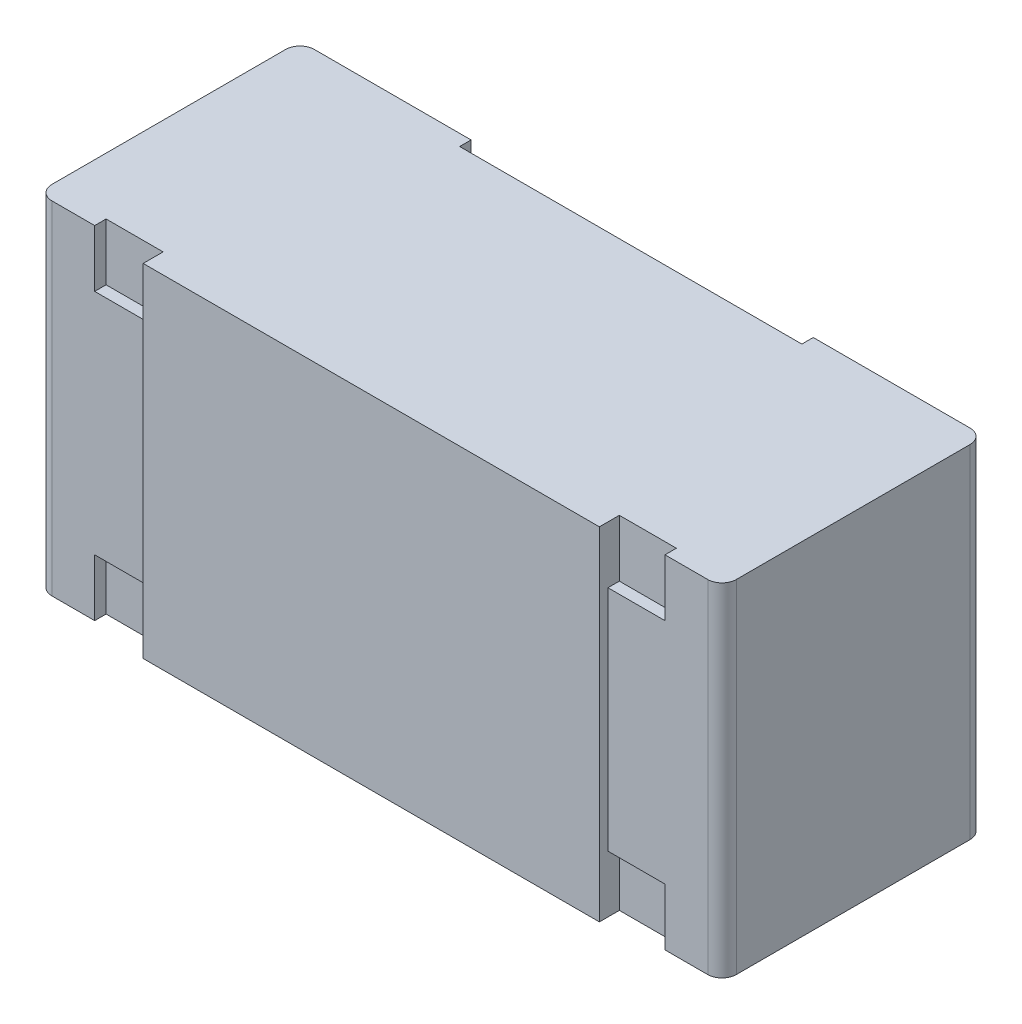
ISO-10303-21;
HEADER;
FILE_DESCRIPTION(('STEP AP214'),'2;1');
FILE_NAME('part.step','',(''),(''),'','','');
FILE_SCHEMA(('AUTOMOTIVE_DESIGN { 1 0 10303 214 1 1 1 1 }'));
ENDSEC;
DATA;
#1=APPLICATION_CONTEXT('core data for automotive mechanical design processes');
#2=APPLICATION_PROTOCOL_DEFINITION('international standard','automotive_design',2000,#1);
#3=PRODUCT_CONTEXT('',#1,'mechanical');
#4=PRODUCT('Part','Part','',(#3));
#5=PRODUCT_RELATED_PRODUCT_CATEGORY('part','',(#4));
#6=PRODUCT_DEFINITION_FORMATION('','',#4);
#7=PRODUCT_DEFINITION_CONTEXT('part definition',#1,'design');
#8=PRODUCT_DEFINITION('design','',#6,#7);
#9=PRODUCT_DEFINITION_SHAPE('','',#8);
#10=(LENGTH_UNIT() NAMED_UNIT(*) SI_UNIT(.MILLI.,.METRE.));
#11=(NAMED_UNIT(*) PLANE_ANGLE_UNIT() SI_UNIT($,.RADIAN.));
#12=(NAMED_UNIT(*) SI_UNIT($,.STERADIAN.) SOLID_ANGLE_UNIT());
#13=UNCERTAINTY_MEASURE_WITH_UNIT(LENGTH_MEASURE(1.E-05),#10,'distance_accuracy_value','');
#14=(GEOMETRIC_REPRESENTATION_CONTEXT(3) GLOBAL_UNCERTAINTY_ASSIGNED_CONTEXT((#13)) GLOBAL_UNIT_ASSIGNED_CONTEXT((#10,
#11,#12)) REPRESENTATION_CONTEXT('',''));
#15=CARTESIAN_POINT('',(0.,0.,0.));
#16=DIRECTION('',(0.,0.,1.));
#17=DIRECTION('',(1.,0.,0.));
#18=AXIS2_PLACEMENT_3D('',#15,#16,#17);
#19=CARTESIAN_POINT('',(-0.2,-0.1,0.149289321881));
#20=DIRECTION('',(0.,1.,0.));
#21=DIRECTION('',(0.,0.,1.));
#22=AXIS2_PLACEMENT_3D('',#19,#20,#21);
#23=PLANE('',#22);
#24=DIRECTION('',(-1.,0.,0.));
#25=VECTOR('',#24,1.);
#26=CARTESIAN_POINT('',(0.3,-0.1,0.23));
#27=LINE('',#26,#25);
#28=CARTESIAN_POINT('',(-0.2,-0.1,0.23));
#29=VERTEX_POINT('',#28);
#30=CARTESIAN_POINT('',(-0.25,-0.1,0.23));
#31=VERTEX_POINT('',#30);
#32=EDGE_CURVE('E406',#29,#31,#27,.T.);
#33=ORIENTED_EDGE('',*,*,#32,.T.);
#34=DIRECTION('',(0.,0.,1.));
#35=VECTOR('',#34,1.);
#36=CARTESIAN_POINT('',(-0.25,-0.1,0.149289321881));
#37=LINE('',#36,#35);
#38=CARTESIAN_POINT('',(-0.25,-0.1,0.22));
#39=VERTEX_POINT('',#38);
#40=EDGE_CURVE('E409',#31,#39,#37,.F.);
#41=ORIENTED_EDGE('',*,*,#40,.T.);
#42=DIRECTION('',(-1.,0.,0.));
#43=VECTOR('',#42,1.);
#44=CARTESIAN_POINT('',(0.2875,-0.1,0.22));
#45=LINE('',#44,#43);
#46=CARTESIAN_POINT('',(-0.2,-0.1,0.22));
#47=VERTEX_POINT('',#46);
#48=EDGE_CURVE('E402',#39,#47,#45,.F.);
#49=ORIENTED_EDGE('',*,*,#48,.T.);
#50=DIRECTION('',(0.,0.,-1.));
#51=VECTOR('',#50,1.);
#52=CARTESIAN_POINT('',(-0.2,-0.1,0.2375));
#53=LINE('',#52,#51);
#54=EDGE_CURVE('E264',#47,#29,#53,.F.);
#55=ORIENTED_EDGE('',*,*,#54,.T.);
#56=EDGE_LOOP('',(#33,#41,#49,#55));
#57=FACE_BOUND('',#56,.T.);
#58=ADVANCED_FACE('F17',(#57),#23,.F.);
#59=CARTESIAN_POINT('',(-0.25,-0.15,0.149289321881));
#60=DIRECTION('',(-1.,0.,0.));
#61=DIRECTION('',(0.,0.,1.));
#62=AXIS2_PLACEMENT_3D('',#59,#60,#61);
#63=PLANE('',#62);
#64=DIRECTION('',(0.,1.,0.));
#65=VECTOR('',#64,1.);
#66=CARTESIAN_POINT('',(-0.25,0.,0.23));
#67=LINE('',#66,#65);
#68=CARTESIAN_POINT('',(-0.25,-0.15,0.23));
#69=VERTEX_POINT('',#68);
#70=EDGE_CURVE('E220',#31,#69,#67,.F.);
#71=ORIENTED_EDGE('',*,*,#70,.T.);
#72=DIRECTION('',(0.,0.,-1.));
#73=VECTOR('',#72,1.);
#74=CARTESIAN_POINT('',(-0.25,-0.15,0.0125));
#75=LINE('',#74,#73);
#76=CARTESIAN_POINT('',(-0.25,-0.15,0.22));
#77=VERTEX_POINT('',#76);
#78=EDGE_CURVE('E215',#77,#69,#75,.F.);
#79=ORIENTED_EDGE('',*,*,#78,.F.);
#80=DIRECTION('',(0.,1.,0.));
#81=VECTOR('',#80,1.);
#82=CARTESIAN_POINT('',(-0.25,0.766846820532,0.22));
#83=LINE('',#82,#81);
#84=EDGE_CURVE('E411',#77,#39,#83,.T.);
#85=ORIENTED_EDGE('',*,*,#84,.T.);
#86=ORIENTED_EDGE('',*,*,#40,.F.);
#87=EDGE_LOOP('',(#71,#79,#85,#86));
#88=FACE_BOUND('',#87,.T.);
#89=ADVANCED_FACE('F649',(#88),#63,.F.);
#90=CARTESIAN_POINT('',(0.2875,0.766846820532,0.22));
#91=DIRECTION('',(0.,0.,-1.));
#92=DIRECTION('',(-1.,0.,0.));
#93=AXIS2_PLACEMENT_3D('',#90,#91,#92);
#94=PLANE('',#93);
#95=DIRECTION('',(1.,0.,0.));
#96=VECTOR('',#95,1.);
#97=CARTESIAN_POINT('',(0.2,-0.1,0.22));
#98=LINE('',#97,#96);
#99=CARTESIAN_POINT('',(0.25,-0.1,0.22));
#100=VERTEX_POINT('',#99);
#101=CARTESIAN_POINT('',(0.2,-0.1,0.22));
#102=VERTEX_POINT('',#101);
#103=EDGE_CURVE('E466',#100,#102,#98,.F.);
#104=ORIENTED_EDGE('',*,*,#103,.T.);
#105=DIRECTION('',(0.,1.,0.));
#106=VECTOR('',#105,1.);
#107=CARTESIAN_POINT('',(0.2,-0.15,0.22));
#108=LINE('',#107,#106);
#109=CARTESIAN_POINT('',(0.2,-0.15,0.22));
#110=VERTEX_POINT('',#109);
#111=EDGE_CURVE('E364',#102,#110,#108,.F.);
#112=ORIENTED_EDGE('',*,*,#111,.T.);
#113=DIRECTION('',(1.,0.,0.));
#114=VECTOR('',#113,1.);
#115=CARTESIAN_POINT('',(0.2875,-0.15,0.22));
#116=LINE('',#115,#114);
#117=CARTESIAN_POINT('',(0.25,-0.15,0.22));
#118=VERTEX_POINT('',#117);
#119=EDGE_CURVE('E434',#118,#110,#116,.F.);
#120=ORIENTED_EDGE('',*,*,#119,.F.);
#121=DIRECTION('',(0.,1.,0.));
#122=VECTOR('',#121,1.);
#123=CARTESIAN_POINT('',(0.25,-0.15,0.22));
#124=LINE('',#123,#122);
#125=EDGE_CURVE('E401',#118,#100,#124,.T.);
#126=ORIENTED_EDGE('',*,*,#125,.T.);
#127=EDGE_LOOP('',(#104,#112,#120,#126));
#128=FACE_BOUND('',#127,.T.);
#129=ADVANCED_FACE('F642',(#128),#94,.F.);
#130=CARTESIAN_POINT('',(0.2875,0.766846820532,0.22));
#131=DIRECTION('',(0.,0.,-1.));
#132=DIRECTION('',(-1.,0.,0.));
#133=AXIS2_PLACEMENT_3D('',#130,#131,#132);
#134=PLANE('',#133);
#135=ORIENTED_EDGE('',*,*,#84,.F.);
#136=DIRECTION('',(1.,0.,0.));
#137=VECTOR('',#136,1.);
#138=CARTESIAN_POINT('',(0.2875,-0.15,0.22));
#139=LINE('',#138,#137);
#140=CARTESIAN_POINT('',(-0.2,-0.15,0.22));
#141=VERTEX_POINT('',#140);
#142=EDGE_CURVE('E304',#141,#77,#139,.F.);
#143=ORIENTED_EDGE('',*,*,#142,.F.);
#144=DIRECTION('',(0.,1.,0.));
#145=VECTOR('',#144,1.);
#146=CARTESIAN_POINT('',(-0.2,0.15,0.22));
#147=LINE('',#146,#145);
#148=EDGE_CURVE('E423',#141,#47,#147,.T.);
#149=ORIENTED_EDGE('',*,*,#148,.T.);
#150=ORIENTED_EDGE('',*,*,#48,.F.);
#151=EDGE_LOOP('',(#135,#143,#149,#150));
#152=FACE_BOUND('',#151,.T.);
#153=ADVANCED_FACE('F648',(#152),#134,.F.);
#154=CARTESIAN_POINT('',(0.25,-0.15,0.149289321881));
#155=DIRECTION('',(1.,0.,0.));
#156=DIRECTION('',(0.,1.,0.));
#157=AXIS2_PLACEMENT_3D('',#154,#155,#156);
#158=PLANE('',#157);
#159=DIRECTION('',(0.,1.,0.));
#160=VECTOR('',#159,1.);
#161=CARTESIAN_POINT('',(0.25,0.,0.23));
#162=LINE('',#161,#160);
#163=CARTESIAN_POINT('',(0.25,-0.15,0.23));
#164=VERTEX_POINT('',#163);
#165=CARTESIAN_POINT('',(0.25,-0.1,0.23));
#166=VERTEX_POINT('',#165);
#167=EDGE_CURVE('E338',#164,#166,#162,.T.);
#168=ORIENTED_EDGE('',*,*,#167,.T.);
#169=DIRECTION('',(0.,0.,1.));
#170=VECTOR('',#169,1.);
#171=CARTESIAN_POINT('',(0.25,-0.1,0.149289321881));
#172=LINE('',#171,#170);
#173=EDGE_CURVE('E345',#166,#100,#172,.F.);
#174=ORIENTED_EDGE('',*,*,#173,.T.);
#175=ORIENTED_EDGE('',*,*,#125,.F.);
#176=DIRECTION('',(0.,0.,-1.));
#177=VECTOR('',#176,1.);
#178=CARTESIAN_POINT('',(0.25,-0.15,0.0125));
#179=LINE('',#178,#177);
#180=EDGE_CURVE('E341',#164,#118,#179,.T.);
#181=ORIENTED_EDGE('',*,*,#180,.F.);
#182=EDGE_LOOP('',(#168,#174,#175,#181));
#183=FACE_BOUND('',#182,.T.);
#184=ADVANCED_FACE('F661',(#183),#158,.F.);
#185=CARTESIAN_POINT('',(0.2,-0.1,0.149289321881));
#186=DIRECTION('',(0.,1.,0.));
#187=DIRECTION('',(0.,0.,1.));
#188=AXIS2_PLACEMENT_3D('',#185,#186,#187);
#189=PLANE('',#188);
#190=DIRECTION('',(-1.,0.,0.));
#191=VECTOR('',#190,1.);
#192=CARTESIAN_POINT('',(0.3,-0.1,0.23));
#193=LINE('',#192,#191);
#194=CARTESIAN_POINT('',(0.2,-0.1,0.23));
#195=VERTEX_POINT('',#194);
#196=EDGE_CURVE('E350',#166,#195,#193,.T.);
#197=ORIENTED_EDGE('',*,*,#196,.T.);
#198=DIRECTION('',(0.,0.,1.));
#199=VECTOR('',#198,1.);
#200=CARTESIAN_POINT('',(0.2,-0.1,0.2375));
#201=LINE('',#200,#199);
#202=EDGE_CURVE('E361',#195,#102,#201,.F.);
#203=ORIENTED_EDGE('',*,*,#202,.T.);
#204=ORIENTED_EDGE('',*,*,#103,.F.);
#205=ORIENTED_EDGE('',*,*,#173,.F.);
#206=EDGE_LOOP('',(#197,#203,#204,#205));
#207=FACE_BOUND('',#206,.T.);
#208=ADVANCED_FACE('F831',(#207),#189,.F.);
#209=CARTESIAN_POINT('',(0.2,0.1,0.149289321881));
#210=DIRECTION('',(0.,-1.,0.));
#211=DIRECTION('',(0.,0.,-1.));
#212=AXIS2_PLACEMENT_3D('',#209,#210,#211);
#213=PLANE('',#212);
#214=DIRECTION('',(-1.,0.,0.));
#215=VECTOR('',#214,1.);
#216=CARTESIAN_POINT('',(0.3,0.1,0.23));
#217=LINE('',#216,#215);
#218=CARTESIAN_POINT('',(0.2,0.1,0.23));
#219=VERTEX_POINT('',#218);
#220=CARTESIAN_POINT('',(0.25,0.1,0.23));
#221=VERTEX_POINT('',#220);
#222=EDGE_CURVE('E325',#219,#221,#217,.F.);
#223=ORIENTED_EDGE('',*,*,#222,.T.);
#224=DIRECTION('',(0.,0.,-1.));
#225=VECTOR('',#224,1.);
#226=CARTESIAN_POINT('',(0.25,0.1,0.149289321881));
#227=LINE('',#226,#225);
#228=CARTESIAN_POINT('',(0.25,0.1,0.22));
#229=VERTEX_POINT('',#228);
#230=EDGE_CURVE('E311',#221,#229,#227,.T.);
#231=ORIENTED_EDGE('',*,*,#230,.T.);
#232=DIRECTION('',(-1.,0.,0.));
#233=VECTOR('',#232,1.);
#234=CARTESIAN_POINT('',(0.2875,0.1,0.22));
#235=LINE('',#234,#233);
#236=CARTESIAN_POINT('',(0.2,0.1,0.22));
#237=VERTEX_POINT('',#236);
#238=EDGE_CURVE('E287',#229,#237,#235,.T.);
#239=ORIENTED_EDGE('',*,*,#238,.T.);
#240=DIRECTION('',(0.,0.,1.));
#241=VECTOR('',#240,1.);
#242=CARTESIAN_POINT('',(0.2,0.1,0.2375));
#243=LINE('',#242,#241);
#244=EDGE_CURVE('E282',#237,#219,#243,.T.);
#245=ORIENTED_EDGE('',*,*,#244,.T.);
#246=EDGE_LOOP('',(#223,#231,#239,#245));
#247=FACE_BOUND('',#246,.T.);
#248=ADVANCED_FACE('F572',(#247),#213,.F.);
#249=CARTESIAN_POINT('',(0.,0.,0.2375));
#250=DIRECTION('',(0.,0.,1.));
#251=DIRECTION('',(1.,0.,0.));
#252=AXIS2_PLACEMENT_3D('',#249,#250,#251);
#253=PLANE('',#252);
#254=DIRECTION('',(0.,1.,0.));
#255=VECTOR('',#254,1.);
#256=CARTESIAN_POINT('',(0.2,-0.15,0.2375));
#257=LINE('',#256,#255);
#258=CARTESIAN_POINT('',(0.2,-0.15,0.2375));
#259=VERTEX_POINT('',#258);
#260=CARTESIAN_POINT('',(0.2,0.15,0.2375));
#261=VERTEX_POINT('',#260);
#262=EDGE_CURVE('E290',#259,#261,#257,.T.);
#263=ORIENTED_EDGE('',*,*,#262,.T.);
#264=DIRECTION('',(1.,0.,0.));
#265=VECTOR('',#264,1.);
#266=CARTESIAN_POINT('',(0.15,0.15,0.2375));
#267=LINE('',#266,#265);
#268=CARTESIAN_POINT('',(-0.2,0.15,0.2375));
#269=VERTEX_POINT('',#268);
#270=EDGE_CURVE('E275',#261,#269,#267,.F.);
#271=ORIENTED_EDGE('',*,*,#270,.T.);
#272=DIRECTION('',(0.,1.,0.));
#273=VECTOR('',#272,1.);
#274=CARTESIAN_POINT('',(-0.2,0.15,0.2375));
#275=LINE('',#274,#273);
#276=CARTESIAN_POINT('',(-0.2,-0.15,0.2375));
#277=VERTEX_POINT('',#276);
#278=EDGE_CURVE('E278',#269,#277,#275,.F.);
#279=ORIENTED_EDGE('',*,*,#278,.T.);
#280=DIRECTION('',(1.,0.,0.));
#281=VECTOR('',#280,1.);
#282=CARTESIAN_POINT('',(0.,-0.15,0.2375));
#283=LINE('',#282,#281);
#284=EDGE_CURVE('E344',#277,#259,#283,.T.);
#285=ORIENTED_EDGE('',*,*,#284,.T.);
#286=EDGE_LOOP('',(#263,#271,#279,#285));
#287=FACE_BOUND('',#286,.T.);
#288=ADVANCED_FACE('F813',(#287),#253,.T.);
#289=CARTESIAN_POINT('',(0.2,-0.15,0.2375));
#290=DIRECTION('',(-1.,0.,0.));
#291=DIRECTION('',(0.,0.,1.));
#292=AXIS2_PLACEMENT_3D('',#289,#290,#291);
#293=PLANE('',#292);
#294=DIRECTION('',(0.,1.,0.));
#295=VECTOR('',#294,1.);
#296=CARTESIAN_POINT('',(0.2,0.766846820532,0.22));
#297=LINE('',#296,#295);
#298=CARTESIAN_POINT('',(0.2,0.15,0.22));
#299=VERTEX_POINT('',#298);
#300=EDGE_CURVE('E444',#237,#299,#297,.T.);
#301=ORIENTED_EDGE('',*,*,#300,.T.);
#302=DIRECTION('',(0.,0.,-1.));
#303=VECTOR('',#302,1.);
#304=CARTESIAN_POINT('',(0.2,0.15,0.));
#305=LINE('',#304,#303);
#306=EDGE_CURVE('E269',#299,#261,#305,.F.);
#307=ORIENTED_EDGE('',*,*,#306,.T.);
#308=ORIENTED_EDGE('',*,*,#262,.F.);
#309=DIRECTION('',(0.,0.,1.));
#310=VECTOR('',#309,1.);
#311=CARTESIAN_POINT('',(0.2,-0.15,0.2375));
#312=LINE('',#311,#310);
#313=EDGE_CURVE('E293',#110,#259,#312,.T.);
#314=ORIENTED_EDGE('',*,*,#313,.F.);
#315=ORIENTED_EDGE('',*,*,#111,.F.);
#316=ORIENTED_EDGE('',*,*,#202,.F.);
#317=DIRECTION('',(0.,1.,0.));
#318=VECTOR('',#317,1.);
#319=CARTESIAN_POINT('',(0.2,0.,0.23));
#320=LINE('',#319,#318);
#321=EDGE_CURVE('E328',#195,#219,#320,.T.);
#322=ORIENTED_EDGE('',*,*,#321,.T.);
#323=ORIENTED_EDGE('',*,*,#244,.F.);
#324=EDGE_LOOP('',(#301,#307,#308,#314,#315,#316,#322,#323));
#325=FACE_BOUND('',#324,.T.);
#326=ADVANCED_FACE('F568',(#325),#293,.F.);
#327=CARTESIAN_POINT('',(-0.2,0.15,0.2375));
#328=DIRECTION('',(1.,0.,0.));
#329=DIRECTION('',(0.,0.,-1.));
#330=AXIS2_PLACEMENT_3D('',#327,#328,#329);
#331=PLANE('',#330);
#332=ORIENTED_EDGE('',*,*,#148,.F.);
#333=DIRECTION('',(0.,0.,-1.));
#334=VECTOR('',#333,1.);
#335=CARTESIAN_POINT('',(-0.2,-0.15,0.2375));
#336=LINE('',#335,#334);
#337=EDGE_CURVE('E281',#277,#141,#336,.T.);
#338=ORIENTED_EDGE('',*,*,#337,.F.);
#339=ORIENTED_EDGE('',*,*,#278,.F.);
#340=DIRECTION('',(0.,0.,-1.));
#341=VECTOR('',#340,1.);
#342=CARTESIAN_POINT('',(-0.2,0.15,0.));
#343=LINE('',#342,#341);
#344=CARTESIAN_POINT('',(-0.2,0.15,0.22));
#345=VERTEX_POINT('',#344);
#346=EDGE_CURVE('E272',#269,#345,#343,.T.);
#347=ORIENTED_EDGE('',*,*,#346,.T.);
#348=DIRECTION('',(0.,1.,0.));
#349=VECTOR('',#348,1.);
#350=CARTESIAN_POINT('',(-0.2,0.766846820532,0.22));
#351=LINE('',#350,#349);
#352=CARTESIAN_POINT('',(-0.2,0.1,0.22));
#353=VERTEX_POINT('',#352);
#354=EDGE_CURVE('E259',#345,#353,#351,.F.);
#355=ORIENTED_EDGE('',*,*,#354,.T.);
#356=DIRECTION('',(0.,0.,-1.));
#357=VECTOR('',#356,1.);
#358=CARTESIAN_POINT('',(-0.2,0.1,0.149289321881));
#359=LINE('',#358,#357);
#360=CARTESIAN_POINT('',(-0.2,0.1,0.23));
#361=VERTEX_POINT('',#360);
#362=EDGE_CURVE('E254',#353,#361,#359,.F.);
#363=ORIENTED_EDGE('',*,*,#362,.T.);
#364=DIRECTION('',(0.,1.,0.));
#365=VECTOR('',#364,1.);
#366=CARTESIAN_POINT('',(-0.2,0.,0.23));
#367=LINE('',#366,#365);
#368=EDGE_CURVE('E253',#361,#29,#367,.F.);
#369=ORIENTED_EDGE('',*,*,#368,.T.);
#370=ORIENTED_EDGE('',*,*,#54,.F.);
#371=EDGE_LOOP('',(#332,#338,#339,#347,#355,#363,#369,#370));
#372=FACE_BOUND('',#371,.T.);
#373=ADVANCED_FACE('F637',(#372),#331,.F.);
#374=CARTESIAN_POINT('',(-0.2,0.1,0.149289321881));
#375=DIRECTION('',(0.,-1.,0.));
#376=DIRECTION('',(0.,0.,-1.));
#377=AXIS2_PLACEMENT_3D('',#374,#375,#376);
#378=PLANE('',#377);
#379=DIRECTION('',(-1.,0.,0.));
#380=VECTOR('',#379,1.);
#381=CARTESIAN_POINT('',(0.3,0.1,0.23));
#382=LINE('',#381,#380);
#383=CARTESIAN_POINT('',(-0.25,0.1,0.23));
#384=VERTEX_POINT('',#383);
#385=EDGE_CURVE('E209',#384,#361,#382,.F.);
#386=ORIENTED_EDGE('',*,*,#385,.T.);
#387=ORIENTED_EDGE('',*,*,#362,.F.);
#388=DIRECTION('',(-1.,0.,0.));
#389=VECTOR('',#388,1.);
#390=CARTESIAN_POINT('',(0.2875,0.1,0.22));
#391=LINE('',#390,#389);
#392=CARTESIAN_POINT('',(-0.25,0.1,0.22));
#393=VERTEX_POINT('',#392);
#394=EDGE_CURVE('E243',#353,#393,#391,.T.);
#395=ORIENTED_EDGE('',*,*,#394,.T.);
#396=DIRECTION('',(0.,0.,1.));
#397=VECTOR('',#396,1.);
#398=CARTESIAN_POINT('',(-0.25,0.1,0.149289321881));
#399=LINE('',#398,#397);
#400=EDGE_CURVE('E251',#393,#384,#399,.T.);
#401=ORIENTED_EDGE('',*,*,#400,.T.);
#402=EDGE_LOOP('',(#386,#387,#395,#401));
#403=FACE_BOUND('',#402,.T.);
#404=ADVANCED_FACE('F792',(#403),#378,.F.);
#405=CARTESIAN_POINT('',(-0.25,0.15,0.149289321881));
#406=DIRECTION('',(-1.,0.,0.));
#407=DIRECTION('',(0.,0.,1.));
#408=AXIS2_PLACEMENT_3D('',#405,#406,#407);
#409=PLANE('',#408);
#410=DIRECTION('',(0.,1.,0.));
#411=VECTOR('',#410,1.);
#412=CARTESIAN_POINT('',(-0.25,0.,0.23));
#413=LINE('',#412,#411);
#414=CARTESIAN_POINT('',(-0.25,0.15,0.23));
#415=VERTEX_POINT('',#414);
#416=EDGE_CURVE('E219',#415,#384,#413,.F.);
#417=ORIENTED_EDGE('',*,*,#416,.T.);
#418=ORIENTED_EDGE('',*,*,#400,.F.);
#419=DIRECTION('',(0.,1.,0.));
#420=VECTOR('',#419,1.);
#421=CARTESIAN_POINT('',(-0.25,0.766846820532,0.22));
#422=LINE('',#421,#420);
#423=CARTESIAN_POINT('',(-0.25,0.15,0.22));
#424=VERTEX_POINT('',#423);
#425=EDGE_CURVE('E238',#393,#424,#422,.T.);
#426=ORIENTED_EDGE('',*,*,#425,.T.);
#427=DIRECTION('',(0.,0.,-1.));
#428=VECTOR('',#427,1.);
#429=CARTESIAN_POINT('',(-0.25,0.15,0.));
#430=LINE('',#429,#428);
#431=EDGE_CURVE('E235',#424,#415,#430,.F.);
#432=ORIENTED_EDGE('',*,*,#431,.T.);
#433=EDGE_LOOP('',(#417,#418,#426,#432));
#434=FACE_BOUND('',#433,.T.);
#435=ADVANCED_FACE('F784',(#434),#409,.F.);
#436=CARTESIAN_POINT('',(0.3,0.,0.23));
#437=DIRECTION('',(0.,0.,-1.));
#438=DIRECTION('',(-1.,0.,0.));
#439=AXIS2_PLACEMENT_3D('',#436,#437,#438);
#440=PLANE('',#439);
#441=ORIENTED_EDGE('',*,*,#416,.F.);
#442=DIRECTION('',(1.,0.,0.));
#443=VECTOR('',#442,1.);
#444=CARTESIAN_POINT('',(0.15,0.15,0.23));
#445=LINE('',#444,#443);
#446=CARTESIAN_POINT('',(-0.2875,0.15,0.23));
#447=VERTEX_POINT('',#446);
#448=EDGE_CURVE('E225',#415,#447,#445,.F.);
#449=ORIENTED_EDGE('',*,*,#448,.T.);
#450=DIRECTION('',(0.,-1.,0.));
#451=VECTOR('',#450,1.);
#452=CARTESIAN_POINT('',(-0.2875,0.,0.23));
#453=LINE('',#452,#451);
#454=CARTESIAN_POINT('',(-0.2875,-0.15,0.23));
#455=VERTEX_POINT('',#454);
#456=EDGE_CURVE('E206',#455,#447,#453,.F.);
#457=ORIENTED_EDGE('',*,*,#456,.F.);
#458=DIRECTION('',(-1.,0.,0.));
#459=VECTOR('',#458,1.);
#460=CARTESIAN_POINT('',(0.3,-0.15,0.23));
#461=LINE('',#460,#459);
#462=EDGE_CURVE('E211',#69,#455,#461,.T.);
#463=ORIENTED_EDGE('',*,*,#462,.F.);
#464=ORIENTED_EDGE('',*,*,#70,.F.);
#465=ORIENTED_EDGE('',*,*,#32,.F.);
#466=ORIENTED_EDGE('',*,*,#368,.F.);
#467=ORIENTED_EDGE('',*,*,#385,.F.);
#468=EDGE_LOOP('',(#441,#449,#457,#463,#464,#465,#466,#467));
#469=FACE_BOUND('',#468,.T.);
#470=ADVANCED_FACE('F223',(#469),#440,.F.);
#471=CARTESIAN_POINT('',(-0.2875,0.,0.2175));
#472=DIRECTION('',(0.,-1.,0.));
#473=DIRECTION('',(0.,0.,-1.));
#474=AXIS2_PLACEMENT_3D('',#471,#472,#473);
#475=CYLINDRICAL_SURFACE('',#474,0.0125);
#476=CARTESIAN_POINT('',(-0.2875,0.15,0.2175));
#477=DIRECTION('',(0.,-1.,0.));
#478=DIRECTION('',(0.,0.,-1.));
#479=AXIS2_PLACEMENT_3D('',#476,#477,#478);
#480=CIRCLE('',#479,0.0125);
#481=CARTESIAN_POINT('',(-0.3,0.15,0.2175));
#482=VERTEX_POINT('',#481);
#483=EDGE_CURVE('E495',#447,#482,#480,.T.);
#484=ORIENTED_EDGE('',*,*,#483,.T.);
#485=DIRECTION('',(0.,1.,0.));
#486=VECTOR('',#485,1.);
#487=CARTESIAN_POINT('',(-0.3,0.,0.2175));
#488=LINE('',#487,#486);
#489=CARTESIAN_POINT('',(-0.3,-0.15,0.2175));
#490=VERTEX_POINT('',#489);
#491=EDGE_CURVE('E208',#482,#490,#488,.F.);
#492=ORIENTED_EDGE('',*,*,#491,.T.);
#493=CARTESIAN_POINT('',(-0.2875,-0.15,0.2175));
#494=DIRECTION('',(0.,-1.,0.));
#495=DIRECTION('',(0.,0.,-1.));
#496=AXIS2_PLACEMENT_3D('',#493,#494,#495);
#497=CIRCLE('',#496,0.0125);
#498=EDGE_CURVE('E20',#490,#455,#497,.F.);
#499=ORIENTED_EDGE('',*,*,#498,.T.);
#500=ORIENTED_EDGE('',*,*,#456,.T.);
#501=EDGE_LOOP('',(#484,#492,#499,#500));
#502=FACE_BOUND('',#501,.T.);
#503=ADVANCED_FACE('F204',(#502),#475,.T.);
#504=CARTESIAN_POINT('',(-0.3,0.,0.23));
#505=DIRECTION('',(1.,0.,0.));
#506=DIRECTION('',(0.,0.,-1.));
#507=AXIS2_PLACEMENT_3D('',#504,#505,#506);
#508=PLANE('',#507);
#509=ORIENTED_EDGE('',*,*,#491,.F.);
#510=DIRECTION('',(0.,0.,-1.));
#511=VECTOR('',#510,1.);
#512=CARTESIAN_POINT('',(-0.3,0.15,0.));
#513=LINE('',#512,#511);
#514=CARTESIAN_POINT('',(-0.3,0.15,0.0125));
#515=VERTEX_POINT('',#514);
#516=EDGE_CURVE('E494',#482,#515,#513,.T.);
#517=ORIENTED_EDGE('',*,*,#516,.T.);
#518=DIRECTION('',(0.,-1.,0.));
#519=VECTOR('',#518,1.);
#520=CARTESIAN_POINT('',(-0.3,0.,0.0125));
#521=LINE('',#520,#519);
#522=CARTESIAN_POINT('',(-0.3,-0.15,0.0125));
#523=VERTEX_POINT('',#522);
#524=EDGE_CURVE('E499',#523,#515,#521,.F.);
#525=ORIENTED_EDGE('',*,*,#524,.F.);
#526=DIRECTION('',(0.,0.,-1.));
#527=VECTOR('',#526,1.);
#528=CARTESIAN_POINT('',(-0.3,-0.15,0.23));
#529=LINE('',#528,#527);
#530=EDGE_CURVE('E227',#490,#523,#529,.T.);
#531=ORIENTED_EDGE('',*,*,#530,.F.);
#532=EDGE_LOOP('',(#509,#517,#525,#531));
#533=FACE_BOUND('',#532,.T.);
#534=ADVANCED_FACE('F761',(#533),#508,.F.);
#535=CARTESIAN_POINT('',(-0.2875,0.,0.0125));
#536=DIRECTION('',(0.,-1.,0.));
#537=DIRECTION('',(0.,0.,-1.));
#538=AXIS2_PLACEMENT_3D('',#535,#536,#537);
#539=CYLINDRICAL_SURFACE('',#538,0.0125);
#540=CARTESIAN_POINT('',(-0.2875,0.15,0.0125));
#541=DIRECTION('',(0.,-1.,0.));
#542=DIRECTION('',(0.,0.,-1.));
#543=AXIS2_PLACEMENT_3D('',#540,#541,#542);
#544=CIRCLE('',#543,0.0125);
#545=CARTESIAN_POINT('',(-0.2875,0.15,0.));
#546=VERTEX_POINT('',#545);
#547=EDGE_CURVE('E490',#515,#546,#544,.T.);
#548=ORIENTED_EDGE('',*,*,#547,.T.);
#549=DIRECTION('',(0.,1.,0.));
#550=VECTOR('',#549,1.);
#551=CARTESIAN_POINT('',(-0.2875,0.,0.));
#552=LINE('',#551,#550);
#553=CARTESIAN_POINT('',(-0.2875,-0.15,0.));
#554=VERTEX_POINT('',#553);
#555=EDGE_CURVE('E380',#546,#554,#552,.F.);
#556=ORIENTED_EDGE('',*,*,#555,.T.);
#557=CARTESIAN_POINT('',(-0.2875,-0.15,0.0125));
#558=DIRECTION('',(0.,-1.,0.));
#559=DIRECTION('',(0.,0.,-1.));
#560=AXIS2_PLACEMENT_3D('',#557,#558,#559);
#561=CIRCLE('',#560,0.0125);
#562=EDGE_CURVE('E392',#554,#523,#561,.F.);
#563=ORIENTED_EDGE('',*,*,#562,.T.);
#564=ORIENTED_EDGE('',*,*,#524,.T.);
#565=EDGE_LOOP('',(#548,#556,#563,#564));
#566=FACE_BOUND('',#565,.T.);
#567=ADVANCED_FACE('F752',(#566),#539,.T.);
#568=CARTESIAN_POINT('',(-0.3,0.,0.));
#569=DIRECTION('',(0.,0.,1.));
#570=DIRECTION('',(1.,0.,0.));
#571=AXIS2_PLACEMENT_3D('',#568,#569,#570);
#572=PLANE('',#571);
#573=DIRECTION('',(0.,1.,0.));
#574=VECTOR('',#573,1.);
#575=CARTESIAN_POINT('',(-0.15,0.,0.));
#576=LINE('',#575,#574);
#577=CARTESIAN_POINT('',(-0.15,-0.15,0.));
#578=VERTEX_POINT('',#577);
#579=CARTESIAN_POINT('',(-0.15,0.15,0.));
#580=VERTEX_POINT('',#579);
#581=EDGE_CURVE('E384',#578,#580,#576,.T.);
#582=ORIENTED_EDGE('',*,*,#581,.F.);
#583=DIRECTION('',(1.,0.,0.));
#584=VECTOR('',#583,1.);
#585=CARTESIAN_POINT('',(-0.3,-0.15,0.));
#586=LINE('',#585,#584);
#587=EDGE_CURVE('E376',#554,#578,#586,.T.);
#588=ORIENTED_EDGE('',*,*,#587,.F.);
#589=ORIENTED_EDGE('',*,*,#555,.F.);
#590=DIRECTION('',(1.,0.,0.));
#591=VECTOR('',#590,1.);
#592=CARTESIAN_POINT('',(0.15,0.15,0.));
#593=LINE('',#592,#591);
#594=EDGE_CURVE('E493',#546,#580,#593,.T.);
#595=ORIENTED_EDGE('',*,*,#594,.T.);
#596=EDGE_LOOP('',(#582,#588,#589,#595));
#597=FACE_BOUND('',#596,.T.);
#598=ADVANCED_FACE('F743',(#597),#572,.F.);
#599=CARTESIAN_POINT('',(-0.15,0.,0.));
#600=DIRECTION('',(1.,0.,0.));
#601=DIRECTION('',(0.,0.,-1.));
#602=AXIS2_PLACEMENT_3D('',#599,#600,#601);
#603=PLANE('',#602);
#604=DIRECTION('',(0.,0.,-1.));
#605=VECTOR('',#604,1.);
#606=CARTESIAN_POINT('',(-0.15,0.15,0.));
#607=LINE('',#606,#605);
#608=CARTESIAN_POINT('',(-0.15,0.15,0.01));
#609=VERTEX_POINT('',#608);
#610=EDGE_CURVE('E389',#580,#609,#607,.F.);
#611=ORIENTED_EDGE('',*,*,#610,.T.);
#612=DIRECTION('',(0.,1.,0.));
#613=VECTOR('',#612,1.);
#614=CARTESIAN_POINT('',(-0.15,0.766846820532,0.01));
#615=LINE('',#614,#613);
#616=CARTESIAN_POINT('',(-0.15,-0.15,0.01));
#617=VERTEX_POINT('',#616);
#618=EDGE_CURVE('E322',#609,#617,#615,.F.);
#619=ORIENTED_EDGE('',*,*,#618,.T.);
#620=DIRECTION('',(0.,0.,-1.));
#621=VECTOR('',#620,1.);
#622=CARTESIAN_POINT('',(-0.15,-0.15,0.));
#623=LINE('',#622,#621);
#624=EDGE_CURVE('E379',#617,#578,#623,.T.);
#625=ORIENTED_EDGE('',*,*,#624,.T.);
#626=ORIENTED_EDGE('',*,*,#581,.T.);
#627=EDGE_LOOP('',(#611,#619,#625,#626));
#628=FACE_BOUND('',#627,.T.);
#629=ADVANCED_FACE('F735',(#628),#603,.T.);
#630=CARTESIAN_POINT('',(0.2875,-0.15,0.0125));
#631=DIRECTION('',(0.,-1.,0.));
#632=DIRECTION('',(0.,0.,-1.));
#633=AXIS2_PLACEMENT_3D('',#630,#631,#632);
#634=PLANE('',#633);
#635=ORIENTED_EDGE('',*,*,#624,.F.);
#636=DIRECTION('',(1.,0.,0.));
#637=VECTOR('',#636,1.);
#638=CARTESIAN_POINT('',(-0.2875,-0.15,0.01));
#639=LINE('',#638,#637);
#640=CARTESIAN_POINT('',(0.15,-0.15,0.01));
#641=VERTEX_POINT('',#640);
#642=EDGE_CURVE('E317',#617,#641,#639,.T.);
#643=ORIENTED_EDGE('',*,*,#642,.T.);
#644=DIRECTION('',(0.,0.,-1.));
#645=VECTOR('',#644,1.);
#646=CARTESIAN_POINT('',(0.15,-0.15,0.));
#647=LINE('',#646,#645);
#648=CARTESIAN_POINT('',(0.15,-0.15,0.));
#649=VERTEX_POINT('',#648);
#650=EDGE_CURVE('E307',#641,#649,#647,.T.);
#651=ORIENTED_EDGE('',*,*,#650,.T.);
#652=DIRECTION('',(1.,0.,0.));
#653=VECTOR('',#652,1.);
#654=CARTESIAN_POINT('',(0.15,-0.15,0.));
#655=LINE('',#654,#653);
#656=CARTESIAN_POINT('',(0.2875,-0.15,0.));
#657=VERTEX_POINT('',#656);
#658=EDGE_CURVE('E300',#649,#657,#655,.T.);
#659=ORIENTED_EDGE('',*,*,#658,.T.);
#660=CARTESIAN_POINT('',(0.2875,-0.15,0.0125));
#661=DIRECTION('',(0.,-1.,0.));
#662=DIRECTION('',(0.,0.,-1.));
#663=AXIS2_PLACEMENT_3D('',#660,#661,#662);
#664=CIRCLE('',#663,0.0125);
#665=CARTESIAN_POINT('',(0.3,-0.15,0.0125));
#666=VERTEX_POINT('',#665);
#667=EDGE_CURVE('E303',#666,#657,#664,.F.);
#668=ORIENTED_EDGE('',*,*,#667,.F.);
#669=DIRECTION('',(0.,0.,1.));
#670=VECTOR('',#669,1.);
#671=CARTESIAN_POINT('',(0.3,-0.15,0.));
#672=LINE('',#671,#670);
#673=CARTESIAN_POINT('',(0.3,-0.15,0.2175));
#674=VERTEX_POINT('',#673);
#675=EDGE_CURVE('E371',#666,#674,#672,.T.);
#676=ORIENTED_EDGE('',*,*,#675,.T.);
#677=CARTESIAN_POINT('',(0.2875,-0.15,0.2175));
#678=DIRECTION('',(0.,-1.,0.));
#679=DIRECTION('',(0.,0.,-1.));
#680=AXIS2_PLACEMENT_3D('',#677,#678,#679);
#681=CIRCLE('',#680,0.0125);
#682=CARTESIAN_POINT('',(0.2875,-0.15,0.23));
#683=VERTEX_POINT('',#682);
#684=EDGE_CURVE('E374',#683,#674,#681,.F.);
#685=ORIENTED_EDGE('',*,*,#684,.F.);
#686=DIRECTION('',(-1.,0.,0.));
#687=VECTOR('',#686,1.);
#688=CARTESIAN_POINT('',(0.3,-0.15,0.23));
#689=LINE('',#688,#687);
#690=EDGE_CURVE('E335',#683,#164,#689,.T.);
#691=ORIENTED_EDGE('',*,*,#690,.T.);
#692=ORIENTED_EDGE('',*,*,#180,.T.);
#693=ORIENTED_EDGE('',*,*,#119,.T.);
#694=ORIENTED_EDGE('',*,*,#313,.T.);
#695=ORIENTED_EDGE('',*,*,#284,.F.);
#696=ORIENTED_EDGE('',*,*,#337,.T.);
#697=ORIENTED_EDGE('',*,*,#142,.T.);
#698=ORIENTED_EDGE('',*,*,#78,.T.);
#699=ORIENTED_EDGE('',*,*,#462,.T.);
#700=ORIENTED_EDGE('',*,*,#498,.F.);
#701=ORIENTED_EDGE('',*,*,#530,.T.);
#702=ORIENTED_EDGE('',*,*,#562,.F.);
#703=ORIENTED_EDGE('',*,*,#587,.T.);
#704=EDGE_LOOP('',(#635,#643,#651,#659,#668,#676,#685,#691,#692,#693,#694,#695,#696,#697,#698,
#699,#700,#701,#702,#703));
#705=FACE_BOUND('',#704,.T.);
#706=ADVANCED_FACE('F212',(#705),#634,.T.);
#707=CARTESIAN_POINT('',(0.15,0.,0.));
#708=DIRECTION('',(0.,0.,1.));
#709=DIRECTION('',(1.,0.,0.));
#710=AXIS2_PLACEMENT_3D('',#707,#708,#709);
#711=PLANE('',#710);
#712=DIRECTION('',(0.,1.,0.));
#713=VECTOR('',#712,1.);
#714=CARTESIAN_POINT('',(0.15,0.,0.));
#715=LINE('',#714,#713);
#716=CARTESIAN_POINT('',(0.15,0.15,0.));
#717=VERTEX_POINT('',#716);
#718=EDGE_CURVE('E310',#649,#717,#715,.T.);
#719=ORIENTED_EDGE('',*,*,#718,.T.);
#720=DIRECTION('',(1.,0.,0.));
#721=VECTOR('',#720,1.);
#722=CARTESIAN_POINT('',(0.15,0.15,0.));
#723=LINE('',#722,#721);
#724=CARTESIAN_POINT('',(0.2875,0.15,0.));
#725=VERTEX_POINT('',#724);
#726=EDGE_CURVE('E316',#717,#725,#723,.T.);
#727=ORIENTED_EDGE('',*,*,#726,.T.);
#728=DIRECTION('',(0.,-1.,0.));
#729=VECTOR('',#728,1.);
#730=CARTESIAN_POINT('',(0.2875,0.,0.));
#731=LINE('',#730,#729);
#732=EDGE_CURVE('E498',#657,#725,#731,.F.);
#733=ORIENTED_EDGE('',*,*,#732,.F.);
#734=ORIENTED_EDGE('',*,*,#658,.F.);
#735=EDGE_LOOP('',(#719,#727,#733,#734));
#736=FACE_BOUND('',#735,.T.);
#737=ADVANCED_FACE('F718',(#736),#711,.F.);
#738=CARTESIAN_POINT('',(0.2875,0.,0.0125));
#739=DIRECTION('',(0.,-1.,0.));
#740=DIRECTION('',(0.,0.,-1.));
#741=AXIS2_PLACEMENT_3D('',#738,#739,#740);
#742=CYLINDRICAL_SURFACE('',#741,0.0125);
#743=CARTESIAN_POINT('',(0.2875,0.15,0.0125));
#744=DIRECTION('',(0.,-1.,0.));
#745=DIRECTION('',(0.,0.,-1.));
#746=AXIS2_PLACEMENT_3D('',#743,#744,#745);
#747=CIRCLE('',#746,0.0125);
#748=CARTESIAN_POINT('',(0.3,0.15,0.0125));
#749=VERTEX_POINT('',#748);
#750=EDGE_CURVE('E487',#725,#749,#747,.T.);
#751=ORIENTED_EDGE('',*,*,#750,.T.);
#752=DIRECTION('',(0.,1.,0.));
#753=VECTOR('',#752,1.);
#754=CARTESIAN_POINT('',(0.3,0.,0.0125));
#755=LINE('',#754,#753);
#756=EDGE_CURVE('E375',#749,#666,#755,.F.);
#757=ORIENTED_EDGE('',*,*,#756,.T.);
#758=ORIENTED_EDGE('',*,*,#667,.T.);
#759=ORIENTED_EDGE('',*,*,#732,.T.);
#760=EDGE_LOOP('',(#751,#757,#758,#759));
#761=FACE_BOUND('',#760,.T.);
#762=ADVANCED_FACE('F709',(#761),#742,.T.);
#763=CARTESIAN_POINT('',(0.3,0.,0.));
#764=DIRECTION('',(-1.,0.,0.));
#765=DIRECTION('',(0.,0.,1.));
#766=AXIS2_PLACEMENT_3D('',#763,#764,#765);
#767=PLANE('',#766);
#768=DIRECTION('',(0.,-1.,0.));
#769=VECTOR('',#768,1.);
#770=CARTESIAN_POINT('',(0.3,0.,0.2175));
#771=LINE('',#770,#769);
#772=CARTESIAN_POINT('',(0.3,0.15,0.2175));
#773=VERTEX_POINT('',#772);
#774=EDGE_CURVE('E355',#674,#773,#771,.F.);
#775=ORIENTED_EDGE('',*,*,#774,.F.);
#776=ORIENTED_EDGE('',*,*,#675,.F.);
#777=ORIENTED_EDGE('',*,*,#756,.F.);
#778=DIRECTION('',(0.,0.,-1.));
#779=VECTOR('',#778,1.);
#780=CARTESIAN_POINT('',(0.3,0.15,0.));
#781=LINE('',#780,#779);
#782=EDGE_CURVE('E486',#749,#773,#781,.F.);
#783=ORIENTED_EDGE('',*,*,#782,.T.);
#784=EDGE_LOOP('',(#775,#776,#777,#783));
#785=FACE_BOUND('',#784,.T.);
#786=ADVANCED_FACE('F700',(#785),#767,.F.);
#787=CARTESIAN_POINT('',(0.2875,0.,0.2175));
#788=DIRECTION('',(0.,-1.,0.));
#789=DIRECTION('',(0.,0.,-1.));
#790=AXIS2_PLACEMENT_3D('',#787,#788,#789);
#791=CYLINDRICAL_SURFACE('',#790,0.0125);
#792=CARTESIAN_POINT('',(0.2875,0.15,0.2175));
#793=DIRECTION('',(0.,-1.,0.));
#794=DIRECTION('',(0.,0.,-1.));
#795=AXIS2_PLACEMENT_3D('',#792,#793,#794);
#796=CIRCLE('',#795,0.0125);
#797=CARTESIAN_POINT('',(0.2875,0.15,0.23));
#798=VERTEX_POINT('',#797);
#799=EDGE_CURVE('E482',#773,#798,#796,.T.);
#800=ORIENTED_EDGE('',*,*,#799,.T.);
#801=DIRECTION('',(0.,1.,0.));
#802=VECTOR('',#801,1.);
#803=CARTESIAN_POINT('',(0.2875,0.,0.23));
#804=LINE('',#803,#802);
#805=EDGE_CURVE('E327',#798,#683,#804,.F.);
#806=ORIENTED_EDGE('',*,*,#805,.T.);
#807=ORIENTED_EDGE('',*,*,#684,.T.);
#808=ORIENTED_EDGE('',*,*,#774,.T.);
#809=EDGE_LOOP('',(#800,#806,#807,#808));
#810=FACE_BOUND('',#809,.T.);
#811=ADVANCED_FACE('F590',(#810),#791,.T.);
#812=CARTESIAN_POINT('',(0.3,0.,0.23));
#813=DIRECTION('',(0.,0.,-1.));
#814=DIRECTION('',(-1.,0.,0.));
#815=AXIS2_PLACEMENT_3D('',#812,#813,#814);
#816=PLANE('',#815);
#817=ORIENTED_EDGE('',*,*,#167,.F.);
#818=ORIENTED_EDGE('',*,*,#690,.F.);
#819=ORIENTED_EDGE('',*,*,#805,.F.);
#820=DIRECTION('',(1.,0.,0.));
#821=VECTOR('',#820,1.);
#822=CARTESIAN_POINT('',(0.15,0.15,0.23));
#823=LINE('',#822,#821);
#824=CARTESIAN_POINT('',(0.25,0.15,0.23));
#825=VERTEX_POINT('',#824);
#826=EDGE_CURVE('E485',#798,#825,#823,.F.);
#827=ORIENTED_EDGE('',*,*,#826,.T.);
#828=DIRECTION('',(0.,1.,0.));
#829=VECTOR('',#828,1.);
#830=CARTESIAN_POINT('',(0.25,0.15,0.23));
#831=LINE('',#830,#829);
#832=EDGE_CURVE('E332',#825,#221,#831,.F.);
#833=ORIENTED_EDGE('',*,*,#832,.T.);
#834=ORIENTED_EDGE('',*,*,#222,.F.);
#835=ORIENTED_EDGE('',*,*,#321,.F.);
#836=ORIENTED_EDGE('',*,*,#196,.F.);
#837=EDGE_LOOP('',(#817,#818,#819,#827,#833,#834,#835,#836));
#838=FACE_BOUND('',#837,.T.);
#839=ADVANCED_FACE('F576',(#838),#816,.F.);
#840=CARTESIAN_POINT('',(0.25,0.15,0.149289321881));
#841=DIRECTION('',(1.,0.,0.));
#842=DIRECTION('',(0.,0.,-1.));
#843=AXIS2_PLACEMENT_3D('',#840,#841,#842);
#844=PLANE('',#843);
#845=ORIENTED_EDGE('',*,*,#832,.F.);
#846=DIRECTION('',(0.,0.,-1.));
#847=VECTOR('',#846,1.);
#848=CARTESIAN_POINT('',(0.25,0.15,0.));
#849=LINE('',#848,#847);
#850=CARTESIAN_POINT('',(0.25,0.15,0.22));
#851=VERTEX_POINT('',#850);
#852=EDGE_CURVE('E516',#825,#851,#849,.T.);
#853=ORIENTED_EDGE('',*,*,#852,.T.);
#854=DIRECTION('',(0.,1.,0.));
#855=VECTOR('',#854,1.);
#856=CARTESIAN_POINT('',(0.25,0.766846820532,0.22));
#857=LINE('',#856,#855);
#858=EDGE_CURVE('E447',#851,#229,#857,.F.);
#859=ORIENTED_EDGE('',*,*,#858,.T.);
#860=ORIENTED_EDGE('',*,*,#230,.F.);
#861=EDGE_LOOP('',(#845,#853,#859,#860));
#862=FACE_BOUND('',#861,.T.);
#863=ADVANCED_FACE('F579',(#862),#844,.F.);
#864=CARTESIAN_POINT('',(0.15,0.,0.));
#865=DIRECTION('',(1.,0.,0.));
#866=DIRECTION('',(0.,0.,-1.));
#867=AXIS2_PLACEMENT_3D('',#864,#865,#866);
#868=PLANE('',#867);
#869=ORIENTED_EDGE('',*,*,#718,.F.);
#870=ORIENTED_EDGE('',*,*,#650,.F.);
#871=DIRECTION('',(0.,1.,0.));
#872=VECTOR('',#871,1.);
#873=CARTESIAN_POINT('',(0.15,0.766846820532,0.00999999999999999));
#874=LINE('',#873,#872);
#875=CARTESIAN_POINT('',(0.15,0.15,0.01));
#876=VERTEX_POINT('',#875);
#877=EDGE_CURVE('E314',#641,#876,#874,.T.);
#878=ORIENTED_EDGE('',*,*,#877,.T.);
#879=DIRECTION('',(0.,0.,-1.));
#880=VECTOR('',#879,1.);
#881=CARTESIAN_POINT('',(0.15,0.15,0.));
#882=LINE('',#881,#880);
#883=EDGE_CURVE('E35',#876,#717,#882,.T.);
#884=ORIENTED_EDGE('',*,*,#883,.T.);
#885=EDGE_LOOP('',(#869,#870,#878,#884));
#886=FACE_BOUND('',#885,.T.);
#887=ADVANCED_FACE('F581',(#886),#868,.F.);
#888=CARTESIAN_POINT('',(0.2875,0.766846820532,0.22));
#889=DIRECTION('',(0.,0.,-1.));
#890=DIRECTION('',(-1.,0.,0.));
#891=AXIS2_PLACEMENT_3D('',#888,#889,#890);
#892=PLANE('',#891);
#893=ORIENTED_EDGE('',*,*,#858,.F.);
#894=DIRECTION('',(1.,0.,0.));
#895=VECTOR('',#894,1.);
#896=CARTESIAN_POINT('',(0.15,0.15,0.22));
#897=LINE('',#896,#895);
#898=EDGE_CURVE('E248',#851,#299,#897,.F.);
#899=ORIENTED_EDGE('',*,*,#898,.T.);
#900=ORIENTED_EDGE('',*,*,#300,.F.);
#901=ORIENTED_EDGE('',*,*,#238,.F.);
#902=EDGE_LOOP('',(#893,#899,#900,#901));
#903=FACE_BOUND('',#902,.T.);
#904=ADVANCED_FACE('F560',(#903),#892,.F.);
#905=CARTESIAN_POINT('',(0.2875,0.766846820532,0.22));
#906=DIRECTION('',(0.,0.,-1.));
#907=DIRECTION('',(-1.,0.,0.));
#908=AXIS2_PLACEMENT_3D('',#905,#906,#907);
#909=PLANE('',#908);
#910=ORIENTED_EDGE('',*,*,#394,.F.);
#911=ORIENTED_EDGE('',*,*,#354,.F.);
#912=DIRECTION('',(1.,0.,0.));
#913=VECTOR('',#912,1.);
#914=CARTESIAN_POINT('',(0.15,0.15,0.22));
#915=LINE('',#914,#913);
#916=EDGE_CURVE('E26',#345,#424,#915,.F.);
#917=ORIENTED_EDGE('',*,*,#916,.T.);
#918=ORIENTED_EDGE('',*,*,#425,.F.);
#919=EDGE_LOOP('',(#910,#911,#917,#918));
#920=FACE_BOUND('',#919,.T.);
#921=ADVANCED_FACE('F598',(#920),#909,.F.);
#922=CARTESIAN_POINT('',(-0.2875,0.766846820532,0.01));
#923=DIRECTION('',(0.,0.,1.));
#924=DIRECTION('',(1.,0.,0.));
#925=AXIS2_PLACEMENT_3D('',#922,#923,#924);
#926=PLANE('',#925);
#927=ORIENTED_EDGE('',*,*,#877,.F.);
#928=ORIENTED_EDGE('',*,*,#642,.F.);
#929=ORIENTED_EDGE('',*,*,#618,.F.);
#930=DIRECTION('',(1.,0.,0.));
#931=VECTOR('',#930,1.);
#932=CARTESIAN_POINT('',(0.15,0.15,0.01));
#933=LINE('',#932,#931);
#934=EDGE_CURVE('E11',#609,#876,#933,.T.);
#935=ORIENTED_EDGE('',*,*,#934,.T.);
#936=EDGE_LOOP('',(#927,#928,#929,#935));
#937=FACE_BOUND('',#936,.T.);
#938=ADVANCED_FACE('F593',(#937),#926,.F.);
#939=CARTESIAN_POINT('',(0.15,0.15,0.));
#940=DIRECTION('',(0.,-1.,0.));
#941=DIRECTION('',(0.,0.,-1.));
#942=AXIS2_PLACEMENT_3D('',#939,#940,#941);
#943=PLANE('',#942);
#944=ORIENTED_EDGE('',*,*,#898,.F.);
#945=ORIENTED_EDGE('',*,*,#852,.F.);
#946=ORIENTED_EDGE('',*,*,#826,.F.);
#947=ORIENTED_EDGE('',*,*,#799,.F.);
#948=ORIENTED_EDGE('',*,*,#782,.F.);
#949=ORIENTED_EDGE('',*,*,#750,.F.);
#950=ORIENTED_EDGE('',*,*,#726,.F.);
#951=ORIENTED_EDGE('',*,*,#883,.F.);
#952=ORIENTED_EDGE('',*,*,#934,.F.);
#953=ORIENTED_EDGE('',*,*,#610,.F.);
#954=ORIENTED_EDGE('',*,*,#594,.F.);
#955=ORIENTED_EDGE('',*,*,#547,.F.);
#956=ORIENTED_EDGE('',*,*,#516,.F.);
#957=ORIENTED_EDGE('',*,*,#483,.F.);
#958=ORIENTED_EDGE('',*,*,#448,.F.);
#959=ORIENTED_EDGE('',*,*,#431,.F.);
#960=ORIENTED_EDGE('',*,*,#916,.F.);
#961=ORIENTED_EDGE('',*,*,#346,.F.);
#962=ORIENTED_EDGE('',*,*,#270,.F.);
#963=ORIENTED_EDGE('',*,*,#306,.F.);
#964=EDGE_LOOP('',(#944,#945,#946,#947,#948,#949,#950,#951,#952,#953,#954,#955,#956,#957,#958,
#959,#960,#961,#962,#963));
#965=FACE_BOUND('',#964,.T.);
#966=ADVANCED_FACE('F563',(#965),#943,.F.);
#967=CLOSED_SHELL('',(#58,#89,#129,#153,#184,#208,#248,#288,#326,#373,#404,#435,#470,#503,#534,
#567,#598,#629,#706,#737,#762,#786,#811,#839,#863,#887,#904,#921,#938,#966));
#968=MANIFOLD_SOLID_BREP('B1',#967);
#969=ADVANCED_BREP_SHAPE_REPRESENTATION('',(#18,#968),#14);
#970=SHAPE_DEFINITION_REPRESENTATION(#9,#969);
ENDSEC;
END-ISO-10303-21;
